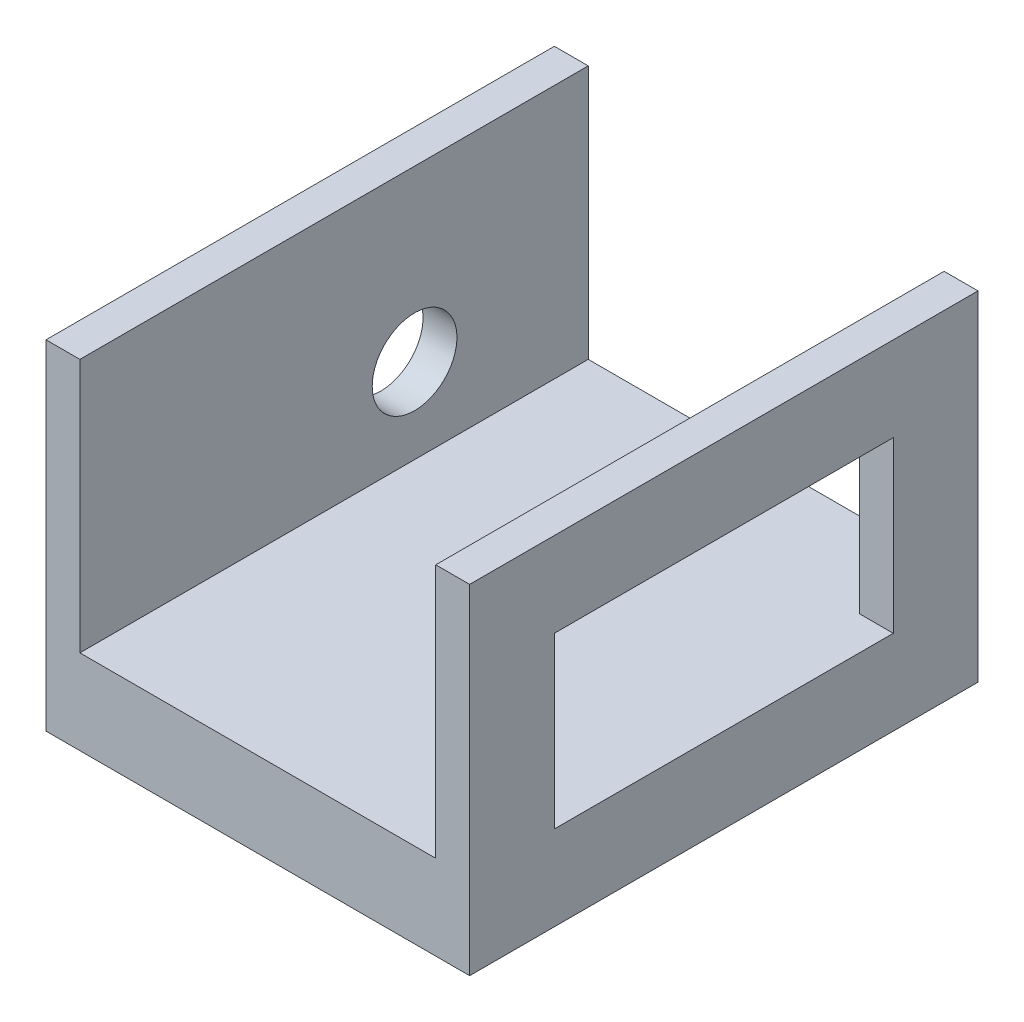
ISO-10303-21;
HEADER;
FILE_DESCRIPTION(('STEP AP214'),'2;1');
FILE_NAME('part.step','',(''),(''),'','','');
FILE_SCHEMA(('AUTOMOTIVE_DESIGN { 1 0 10303 214 1 1 1 1 }'));
ENDSEC;
DATA;
#1=APPLICATION_CONTEXT('core data for automotive mechanical design processes');
#2=APPLICATION_PROTOCOL_DEFINITION('international standard','automotive_design',2000,#1);
#3=PRODUCT_CONTEXT('',#1,'mechanical');
#4=PRODUCT('Part','Part','',(#3));
#5=PRODUCT_RELATED_PRODUCT_CATEGORY('part','',(#4));
#6=PRODUCT_DEFINITION_FORMATION('','',#4);
#7=PRODUCT_DEFINITION_CONTEXT('part definition',#1,'design');
#8=PRODUCT_DEFINITION('design','',#6,#7);
#9=PRODUCT_DEFINITION_SHAPE('','',#8);
#10=(LENGTH_UNIT() NAMED_UNIT(*) SI_UNIT(.MILLI.,.METRE.));
#11=(NAMED_UNIT(*) PLANE_ANGLE_UNIT() SI_UNIT($,.RADIAN.));
#12=(NAMED_UNIT(*) SI_UNIT($,.STERADIAN.) SOLID_ANGLE_UNIT());
#13=UNCERTAINTY_MEASURE_WITH_UNIT(LENGTH_MEASURE(1.E-05),#10,'distance_accuracy_value','');
#14=(GEOMETRIC_REPRESENTATION_CONTEXT(3) GLOBAL_UNCERTAINTY_ASSIGNED_CONTEXT((#13)) GLOBAL_UNIT_ASSIGNED_CONTEXT((#10,
#11,#12)) REPRESENTATION_CONTEXT('',''));
#15=CARTESIAN_POINT('',(0.,0.,0.));
#16=DIRECTION('',(0.,0.,1.));
#17=DIRECTION('',(1.,0.,0.));
#18=AXIS2_PLACEMENT_3D('',#15,#16,#17);
#19=CARTESIAN_POINT('',(0.,40.,0.));
#20=DIRECTION('',(0.,1.,0.));
#21=DIRECTION('',(0.,0.,1.));
#22=AXIS2_PLACEMENT_3D('',#19,#20,#21);
#23=PLANE('',#22);
#24=DIRECTION('',(0.,0.,1.));
#25=VECTOR('',#24,1.);
#26=CARTESIAN_POINT('',(-21.,40.,0.));
#27=LINE('',#26,#25);
#28=CARTESIAN_POINT('',(-21.,40.,-30.));
#29=VERTEX_POINT('',#28);
#30=CARTESIAN_POINT('',(-21.,40.,30.));
#31=VERTEX_POINT('',#30);
#32=EDGE_CURVE('E55',#29,#31,#27,.T.);
#33=ORIENTED_EDGE('',*,*,#32,.F.);
#34=DIRECTION('',(-1.,0.,0.));
#35=VECTOR('',#34,1.);
#36=CARTESIAN_POINT('',(-25.,40.,-30.));
#37=LINE('',#36,#35);
#38=CARTESIAN_POINT('',(-25.,40.,-30.));
#39=VERTEX_POINT('',#38);
#40=EDGE_CURVE('E211',#29,#39,#37,.T.);
#41=ORIENTED_EDGE('',*,*,#40,.T.);
#42=DIRECTION('',(0.,0.,1.));
#43=VECTOR('',#42,1.);
#44=CARTESIAN_POINT('',(-25.,40.,-30.));
#45=LINE('',#44,#43);
#46=CARTESIAN_POINT('',(-25.,40.,30.));
#47=VERTEX_POINT('',#46);
#48=EDGE_CURVE('E217',#39,#47,#45,.T.);
#49=ORIENTED_EDGE('',*,*,#48,.T.);
#50=DIRECTION('',(1.,0.,0.));
#51=VECTOR('',#50,1.);
#52=CARTESIAN_POINT('',(-25.,40.,30.));
#53=LINE('',#52,#51);
#54=EDGE_CURVE('E221',#47,#31,#53,.T.);
#55=ORIENTED_EDGE('',*,*,#54,.T.);
#56=EDGE_LOOP('',(#33,#41,#49,#55));
#57=FACE_BOUND('',#56,.T.);
#58=ADVANCED_FACE('F45',(#57),#23,.T.);
#59=CARTESIAN_POINT('',(25.,40.,-30.));
#60=DIRECTION('',(-1.,0.,0.));
#61=DIRECTION('',(0.,0.,1.));
#62=AXIS2_PLACEMENT_3D('',#59,#60,#61);
#63=PLANE('',#62);
#64=DIRECTION('',(0.,0.,-1.));
#65=VECTOR('',#64,1.);
#66=CARTESIAN_POINT('',(25.,10.,20.));
#67=LINE('',#66,#65);
#68=CARTESIAN_POINT('',(25.,10.,20.));
#69=VERTEX_POINT('',#68);
#70=CARTESIAN_POINT('',(25.,10.,-20.));
#71=VERTEX_POINT('',#70);
#72=EDGE_CURVE('E148',#69,#71,#67,.T.);
#73=ORIENTED_EDGE('',*,*,#72,.F.);
#74=DIRECTION('',(0.,-1.,0.));
#75=VECTOR('',#74,1.);
#76=CARTESIAN_POINT('',(25.,10.,20.));
#77=LINE('',#76,#75);
#78=CARTESIAN_POINT('',(25.,30.,20.));
#79=VERTEX_POINT('',#78);
#80=EDGE_CURVE('E62',#79,#69,#77,.T.);
#81=ORIENTED_EDGE('',*,*,#80,.F.);
#82=DIRECTION('',(0.,0.,1.));
#83=VECTOR('',#82,1.);
#84=CARTESIAN_POINT('',(25.,30.,20.));
#85=LINE('',#84,#83);
#86=CARTESIAN_POINT('',(25.,30.,-20.));
#87=VERTEX_POINT('',#86);
#88=EDGE_CURVE('E156',#87,#79,#85,.T.);
#89=ORIENTED_EDGE('',*,*,#88,.F.);
#90=DIRECTION('',(0.,1.,0.));
#91=VECTOR('',#90,1.);
#92=CARTESIAN_POINT('',(25.,10.,-20.));
#93=LINE('',#92,#91);
#94=EDGE_CURVE('E138',#71,#87,#93,.T.);
#95=ORIENTED_EDGE('',*,*,#94,.F.);
#96=EDGE_LOOP('',(#73,#81,#89,#95));
#97=FACE_BOUND('',#96,.T.);
#98=DIRECTION('',(0.,0.,-1.));
#99=VECTOR('',#98,1.);
#100=CARTESIAN_POINT('',(25.,0.,-30.));
#101=LINE('',#100,#99);
#102=CARTESIAN_POINT('',(25.,0.,30.));
#103=VERTEX_POINT('',#102);
#104=CARTESIAN_POINT('',(25.,0.,-30.));
#105=VERTEX_POINT('',#104);
#106=EDGE_CURVE('E202',#103,#105,#101,.T.);
#107=ORIENTED_EDGE('',*,*,#106,.T.);
#108=DIRECTION('',(0.,-1.,0.));
#109=VECTOR('',#108,1.);
#110=CARTESIAN_POINT('',(25.,40.,-30.));
#111=LINE('',#110,#109);
#112=CARTESIAN_POINT('',(25.,40.,-30.));
#113=VERTEX_POINT('',#112);
#114=EDGE_CURVE('E248',#113,#105,#111,.T.);
#115=ORIENTED_EDGE('',*,*,#114,.F.);
#116=DIRECTION('',(0.,0.,-1.));
#117=VECTOR('',#116,1.);
#118=CARTESIAN_POINT('',(25.,40.,-30.));
#119=LINE('',#118,#117);
#120=CARTESIAN_POINT('',(25.,40.,30.));
#121=VERTEX_POINT('',#120);
#122=EDGE_CURVE('E207',#121,#113,#119,.T.);
#123=ORIENTED_EDGE('',*,*,#122,.F.);
#124=DIRECTION('',(0.,-1.,0.));
#125=VECTOR('',#124,1.);
#126=CARTESIAN_POINT('',(25.,40.,30.));
#127=LINE('',#126,#125);
#128=EDGE_CURVE('E225',#121,#103,#127,.T.);
#129=ORIENTED_EDGE('',*,*,#128,.T.);
#130=EDGE_LOOP('',(#107,#115,#123,#129));
#131=FACE_BOUND('',#130,.T.);
#132=ADVANCED_FACE('F47',(#97,#131),#63,.F.);
#133=CARTESIAN_POINT('',(-25.,40.,-30.));
#134=DIRECTION('',(0.,0.,1.));
#135=DIRECTION('',(1.,0.,0.));
#136=AXIS2_PLACEMENT_3D('',#133,#134,#135);
#137=PLANE('',#136);
#138=ORIENTED_EDGE('',*,*,#40,.F.);
#139=DIRECTION('',(0.,-1.,0.));
#140=VECTOR('',#139,1.);
#141=CARTESIAN_POINT('',(-21.,10.,-30.));
#142=LINE('',#141,#140);
#143=CARTESIAN_POINT('',(-21.,10.,-30.));
#144=VERTEX_POINT('',#143);
#145=EDGE_CURVE('E177',#29,#144,#142,.T.);
#146=ORIENTED_EDGE('',*,*,#145,.T.);
#147=DIRECTION('',(1.,0.,0.));
#148=VECTOR('',#147,1.);
#149=CARTESIAN_POINT('',(-21.,10.,-30.));
#150=LINE('',#149,#148);
#151=CARTESIAN_POINT('',(21.,10.,-30.));
#152=VERTEX_POINT('',#151);
#153=EDGE_CURVE('E181',#144,#152,#150,.T.);
#154=ORIENTED_EDGE('',*,*,#153,.T.);
#155=DIRECTION('',(0.,1.,0.));
#156=VECTOR('',#155,1.);
#157=CARTESIAN_POINT('',(21.,10.,-30.));
#158=LINE('',#157,#156);
#159=CARTESIAN_POINT('',(21.,40.,-30.));
#160=VERTEX_POINT('',#159);
#161=EDGE_CURVE('E186',#152,#160,#158,.T.);
#162=ORIENTED_EDGE('',*,*,#161,.T.);
#163=EDGE_CURVE('E213',#113,#160,#37,.T.);
#164=ORIENTED_EDGE('',*,*,#163,.F.);
#165=ORIENTED_EDGE('',*,*,#114,.T.);
#166=DIRECTION('',(-1.,0.,0.));
#167=VECTOR('',#166,1.);
#168=CARTESIAN_POINT('',(-25.,0.,-30.));
#169=LINE('',#168,#167);
#170=CARTESIAN_POINT('',(-25.,0.,-30.));
#171=VERTEX_POINT('',#170);
#172=EDGE_CURVE('E229',#105,#171,#169,.T.);
#173=ORIENTED_EDGE('',*,*,#172,.T.);
#174=DIRECTION('',(0.,-1.,0.));
#175=VECTOR('',#174,1.);
#176=CARTESIAN_POINT('',(-25.,40.,-30.));
#177=LINE('',#176,#175);
#178=EDGE_CURVE('E244',#39,#171,#177,.T.);
#179=ORIENTED_EDGE('',*,*,#178,.F.);
#180=EDGE_LOOP('',(#138,#146,#154,#162,#164,#165,#173,#179));
#181=FACE_BOUND('',#180,.T.);
#182=ADVANCED_FACE('F291',(#181),#137,.F.);
#183=CARTESIAN_POINT('',(-25.,40.,-30.));
#184=DIRECTION('',(1.,0.,0.));
#185=DIRECTION('',(0.,0.,-1.));
#186=AXIS2_PLACEMENT_3D('',#183,#184,#185);
#187=PLANE('',#186);
#188=CARTESIAN_POINT('',(-25.,20.,-9.5));
#189=DIRECTION('',(-1.,0.,0.));
#190=DIRECTION('',(0.,0.,1.));
#191=AXIS2_PLACEMENT_3D('',#188,#189,#190);
#192=CIRCLE('',#191,5.);
#193=CARTESIAN_POINT('',(-25.,20.,-4.5));
#194=VERTEX_POINT('',#193);
#195=EDGE_CURVE('E321',#194,#194,#192,.T.);
#196=ORIENTED_EDGE('',*,*,#195,.F.);
#197=EDGE_LOOP('',(#196));
#198=FACE_BOUND('',#197,.T.);
#199=DIRECTION('',(0.,0.,1.));
#200=VECTOR('',#199,1.);
#201=CARTESIAN_POINT('',(-25.,0.,-30.));
#202=LINE('',#201,#200);
#203=CARTESIAN_POINT('',(-25.,0.,30.));
#204=VERTEX_POINT('',#203);
#205=EDGE_CURVE('E232',#171,#204,#202,.T.);
#206=ORIENTED_EDGE('',*,*,#205,.T.);
#207=DIRECTION('',(0.,-1.,0.));
#208=VECTOR('',#207,1.);
#209=CARTESIAN_POINT('',(-25.,40.,30.));
#210=LINE('',#209,#208);
#211=EDGE_CURVE('E240',#47,#204,#210,.T.);
#212=ORIENTED_EDGE('',*,*,#211,.F.);
#213=ORIENTED_EDGE('',*,*,#48,.F.);
#214=ORIENTED_EDGE('',*,*,#178,.T.);
#215=EDGE_LOOP('',(#206,#212,#213,#214));
#216=FACE_BOUND('',#215,.T.);
#217=ADVANCED_FACE('F271',(#198,#216),#187,.F.);
#218=CARTESIAN_POINT('',(-25.,40.,30.));
#219=DIRECTION('',(0.,0.,-1.));
#220=DIRECTION('',(-1.,0.,0.));
#221=AXIS2_PLACEMENT_3D('',#218,#219,#220);
#222=PLANE('',#221);
#223=DIRECTION('',(1.,0.,0.));
#224=VECTOR('',#223,1.);
#225=CARTESIAN_POINT('',(-21.,10.,30.));
#226=LINE('',#225,#224);
#227=CARTESIAN_POINT('',(-21.,10.,30.));
#228=VERTEX_POINT('',#227);
#229=CARTESIAN_POINT('',(21.,10.,30.));
#230=VERTEX_POINT('',#229);
#231=EDGE_CURVE('E193',#228,#230,#226,.T.);
#232=ORIENTED_EDGE('',*,*,#231,.F.);
#233=DIRECTION('',(0.,-1.,0.));
#234=VECTOR('',#233,1.);
#235=CARTESIAN_POINT('',(-21.,10.,30.));
#236=LINE('',#235,#234);
#237=EDGE_CURVE('E176',#31,#228,#236,.T.);
#238=ORIENTED_EDGE('',*,*,#237,.F.);
#239=ORIENTED_EDGE('',*,*,#54,.F.);
#240=ORIENTED_EDGE('',*,*,#211,.T.);
#241=DIRECTION('',(1.,0.,0.));
#242=VECTOR('',#241,1.);
#243=CARTESIAN_POINT('',(-25.,0.,30.));
#244=LINE('',#243,#242);
#245=EDGE_CURVE('E212',#204,#103,#244,.T.);
#246=ORIENTED_EDGE('',*,*,#245,.T.);
#247=ORIENTED_EDGE('',*,*,#128,.F.);
#248=CARTESIAN_POINT('',(21.,40.,30.));
#249=VERTEX_POINT('',#248);
#250=EDGE_CURVE('E220',#249,#121,#53,.T.);
#251=ORIENTED_EDGE('',*,*,#250,.F.);
#252=DIRECTION('',(0.,1.,0.));
#253=VECTOR('',#252,1.);
#254=CARTESIAN_POINT('',(21.,10.,30.));
#255=LINE('',#254,#253);
#256=EDGE_CURVE('E182',#230,#249,#255,.T.);
#257=ORIENTED_EDGE('',*,*,#256,.F.);
#258=EDGE_LOOP('',(#232,#238,#239,#240,#246,#247,#251,#257));
#259=FACE_BOUND('',#258,.T.);
#260=ADVANCED_FACE('F265',(#259),#222,.F.);
#261=DIRECTION('',(0.,0.,-1.));
#262=VECTOR('',#261,1.);
#263=CARTESIAN_POINT('',(21.,40.,0.));
#264=LINE('',#263,#262);
#265=EDGE_CURVE('E252',#249,#160,#264,.T.);
#266=ORIENTED_EDGE('',*,*,#265,.F.);
#267=ORIENTED_EDGE('',*,*,#250,.T.);
#268=ORIENTED_EDGE('',*,*,#122,.T.);
#269=ORIENTED_EDGE('',*,*,#163,.T.);
#270=EDGE_LOOP('',(#266,#267,#268,#269));
#271=FACE_BOUND('',#270,.T.);
#272=ADVANCED_FACE('F292',(#271),#23,.T.);
#273=CARTESIAN_POINT('',(0.,0.,0.));
#274=DIRECTION('',(0.,1.,0.));
#275=DIRECTION('',(0.,0.,1.));
#276=AXIS2_PLACEMENT_3D('',#273,#274,#275);
#277=PLANE('',#276);
#278=ORIENTED_EDGE('',*,*,#106,.F.);
#279=ORIENTED_EDGE('',*,*,#245,.F.);
#280=ORIENTED_EDGE('',*,*,#205,.F.);
#281=ORIENTED_EDGE('',*,*,#172,.F.);
#282=EDGE_LOOP('',(#278,#279,#280,#281));
#283=FACE_BOUND('',#282,.T.);
#284=ADVANCED_FACE('F277',(#283),#277,.F.);
#285=CARTESIAN_POINT('',(-21.,10.,-30.));
#286=DIRECTION('',(-1.,0.,0.));
#287=DIRECTION('',(0.,0.,1.));
#288=AXIS2_PLACEMENT_3D('',#285,#286,#287);
#289=PLANE('',#288);
#290=CARTESIAN_POINT('',(-21.,20.,-9.5));
#291=DIRECTION('',(-1.,0.,0.));
#292=DIRECTION('',(0.,0.,1.));
#293=AXIS2_PLACEMENT_3D('',#290,#291,#292);
#294=CIRCLE('',#293,5.);
#295=CARTESIAN_POINT('',(-21.,20.,-4.5));
#296=VERTEX_POINT('',#295);
#297=EDGE_CURVE('E49',#296,#296,#294,.T.);
#298=ORIENTED_EDGE('',*,*,#297,.T.);
#299=EDGE_LOOP('',(#298));
#300=FACE_BOUND('',#299,.T.);
#301=ORIENTED_EDGE('',*,*,#32,.T.);
#302=ORIENTED_EDGE('',*,*,#237,.T.);
#303=DIRECTION('',(0.,0.,1.));
#304=VECTOR('',#303,1.);
#305=CARTESIAN_POINT('',(-21.,10.,-30.));
#306=LINE('',#305,#304);
#307=EDGE_CURVE('E190',#144,#228,#306,.T.);
#308=ORIENTED_EDGE('',*,*,#307,.F.);
#309=ORIENTED_EDGE('',*,*,#145,.F.);
#310=EDGE_LOOP('',(#301,#302,#308,#309));
#311=FACE_BOUND('',#310,.T.);
#312=ADVANCED_FACE('F259',(#300,#311),#289,.F.);
#313=CARTESIAN_POINT('',(21.,10.,-30.));
#314=DIRECTION('',(1.,0.,0.));
#315=DIRECTION('',(0.,0.,-1.));
#316=AXIS2_PLACEMENT_3D('',#313,#314,#315);
#317=PLANE('',#316);
#318=DIRECTION('',(0.,0.,1.));
#319=VECTOR('',#318,1.);
#320=CARTESIAN_POINT('',(21.,30.,-30.));
#321=LINE('',#320,#319);
#322=CARTESIAN_POINT('',(21.,30.,-20.));
#323=VERTEX_POINT('',#322);
#324=CARTESIAN_POINT('',(21.,30.,20.));
#325=VERTEX_POINT('',#324);
#326=EDGE_CURVE('E11',#323,#325,#321,.T.);
#327=ORIENTED_EDGE('',*,*,#326,.T.);
#328=DIRECTION('',(0.,-1.,0.));
#329=VECTOR('',#328,1.);
#330=CARTESIAN_POINT('',(21.,10.,20.));
#331=LINE('',#330,#329);
#332=CARTESIAN_POINT('',(21.,10.,20.));
#333=VERTEX_POINT('',#332);
#334=EDGE_CURVE('E172',#325,#333,#331,.T.);
#335=ORIENTED_EDGE('',*,*,#334,.T.);
#336=DIRECTION('',(0.,0.,1.));
#337=VECTOR('',#336,1.);
#338=CARTESIAN_POINT('',(21.,10.,-30.));
#339=LINE('',#338,#337);
#340=EDGE_CURVE('E203',#333,#230,#339,.T.);
#341=ORIENTED_EDGE('',*,*,#340,.T.);
#342=ORIENTED_EDGE('',*,*,#256,.T.);
#343=ORIENTED_EDGE('',*,*,#265,.T.);
#344=ORIENTED_EDGE('',*,*,#161,.F.);
#345=CARTESIAN_POINT('',(21.,10.,-20.));
#346=VERTEX_POINT('',#345);
#347=EDGE_CURVE('E199',#152,#346,#339,.T.);
#348=ORIENTED_EDGE('',*,*,#347,.T.);
#349=DIRECTION('',(0.,1.,0.));
#350=VECTOR('',#349,1.);
#351=CARTESIAN_POINT('',(21.,10.,-20.));
#352=LINE('',#351,#350);
#353=EDGE_CURVE('E141',#346,#323,#352,.T.);
#354=ORIENTED_EDGE('',*,*,#353,.T.);
#355=EDGE_LOOP('',(#327,#335,#341,#342,#343,#344,#348,#354));
#356=FACE_BOUND('',#355,.T.);
#357=ADVANCED_FACE('F287',(#356),#317,.F.);
#358=CARTESIAN_POINT('',(-21.,10.,-30.));
#359=DIRECTION('',(0.,-1.,0.));
#360=DIRECTION('',(0.,0.,-1.));
#361=AXIS2_PLACEMENT_3D('',#358,#359,#360);
#362=PLANE('',#361);
#363=ORIENTED_EDGE('',*,*,#340,.F.);
#364=DIRECTION('',(1.,0.,0.));
#365=VECTOR('',#364,1.);
#366=CARTESIAN_POINT('',(5.00000000000001,10.,20.));
#367=LINE('',#366,#365);
#368=EDGE_CURVE('E145',#333,#69,#367,.T.);
#369=ORIENTED_EDGE('',*,*,#368,.T.);
#370=ORIENTED_EDGE('',*,*,#72,.T.);
#371=DIRECTION('',(1.,0.,0.));
#372=VECTOR('',#371,1.);
#373=CARTESIAN_POINT('',(5.,10.,-20.));
#374=LINE('',#373,#372);
#375=EDGE_CURVE('E70',#346,#71,#374,.T.);
#376=ORIENTED_EDGE('',*,*,#375,.F.);
#377=ORIENTED_EDGE('',*,*,#347,.F.);
#378=ORIENTED_EDGE('',*,*,#153,.F.);
#379=ORIENTED_EDGE('',*,*,#307,.T.);
#380=ORIENTED_EDGE('',*,*,#231,.T.);
#381=EDGE_LOOP('',(#363,#369,#370,#376,#377,#378,#379,#380));
#382=FACE_BOUND('',#381,.T.);
#383=ADVANCED_FACE('F150',(#382),#362,.F.);
#384=CARTESIAN_POINT('',(5.00000000000001,30.,20.));
#385=DIRECTION('',(0.,1.,0.));
#386=DIRECTION('',(0.,0.,1.));
#387=AXIS2_PLACEMENT_3D('',#384,#385,#386);
#388=PLANE('',#387);
#389=DIRECTION('',(1.,0.,0.));
#390=VECTOR('',#389,1.);
#391=CARTESIAN_POINT('',(5.,30.,-20.));
#392=LINE('',#391,#390);
#393=EDGE_CURVE('E144',#323,#87,#392,.T.);
#394=ORIENTED_EDGE('',*,*,#393,.T.);
#395=ORIENTED_EDGE('',*,*,#88,.T.);
#396=DIRECTION('',(1.,0.,0.));
#397=VECTOR('',#396,1.);
#398=CARTESIAN_POINT('',(5.00000000000001,30.,20.));
#399=LINE('',#398,#397);
#400=EDGE_CURVE('E163',#325,#79,#399,.T.);
#401=ORIENTED_EDGE('',*,*,#400,.F.);
#402=ORIENTED_EDGE('',*,*,#326,.F.);
#403=EDGE_LOOP('',(#394,#395,#401,#402));
#404=FACE_BOUND('',#403,.T.);
#405=ADVANCED_FACE('F339',(#404),#388,.F.);
#406=CARTESIAN_POINT('',(5.00000000000001,10.,20.));
#407=DIRECTION('',(0.,0.,1.));
#408=DIRECTION('',(1.,0.,0.));
#409=AXIS2_PLACEMENT_3D('',#406,#407,#408);
#410=PLANE('',#409);
#411=ORIENTED_EDGE('',*,*,#400,.T.);
#412=ORIENTED_EDGE('',*,*,#80,.T.);
#413=ORIENTED_EDGE('',*,*,#368,.F.);
#414=ORIENTED_EDGE('',*,*,#334,.F.);
#415=EDGE_LOOP('',(#411,#412,#413,#414));
#416=FACE_BOUND('',#415,.T.);
#417=ADVANCED_FACE('F336',(#416),#410,.F.);
#418=CARTESIAN_POINT('',(5.,10.,-20.));
#419=DIRECTION('',(0.,0.,-1.));
#420=DIRECTION('',(-1.,0.,0.));
#421=AXIS2_PLACEMENT_3D('',#418,#419,#420);
#422=PLANE('',#421);
#423=ORIENTED_EDGE('',*,*,#375,.T.);
#424=ORIENTED_EDGE('',*,*,#94,.T.);
#425=ORIENTED_EDGE('',*,*,#393,.F.);
#426=ORIENTED_EDGE('',*,*,#353,.F.);
#427=EDGE_LOOP('',(#423,#424,#425,#426));
#428=FACE_BOUND('',#427,.T.);
#429=ADVANCED_FACE('F135',(#428),#422,.F.);
#430=CARTESIAN_POINT('',(-15.,20.,-9.5));
#431=DIRECTION('',(-1.,0.,0.));
#432=DIRECTION('',(0.,0.,1.));
#433=AXIS2_PLACEMENT_3D('',#430,#431,#432);
#434=CYLINDRICAL_SURFACE('',#433,5.);
#435=ORIENTED_EDGE('',*,*,#195,.T.);
#436=EDGE_LOOP('',(#435));
#437=FACE_BOUND('',#436,.T.);
#438=ORIENTED_EDGE('',*,*,#297,.F.);
#439=EDGE_LOOP('',(#438));
#440=FACE_BOUND('',#439,.T.);
#441=ADVANCED_FACE('F331',(#437,#440),#434,.F.);
#442=CLOSED_SHELL('',(#58,#132,#182,#217,#260,#272,#284,#312,#357,#383,#405,#417,#429,#441));
#443=MANIFOLD_SOLID_BREP('B2',#442);
#444=ADVANCED_BREP_SHAPE_REPRESENTATION('',(#18,#443),#14);
#445=SHAPE_DEFINITION_REPRESENTATION(#9,#444);
ENDSEC;
END-ISO-10303-21;
